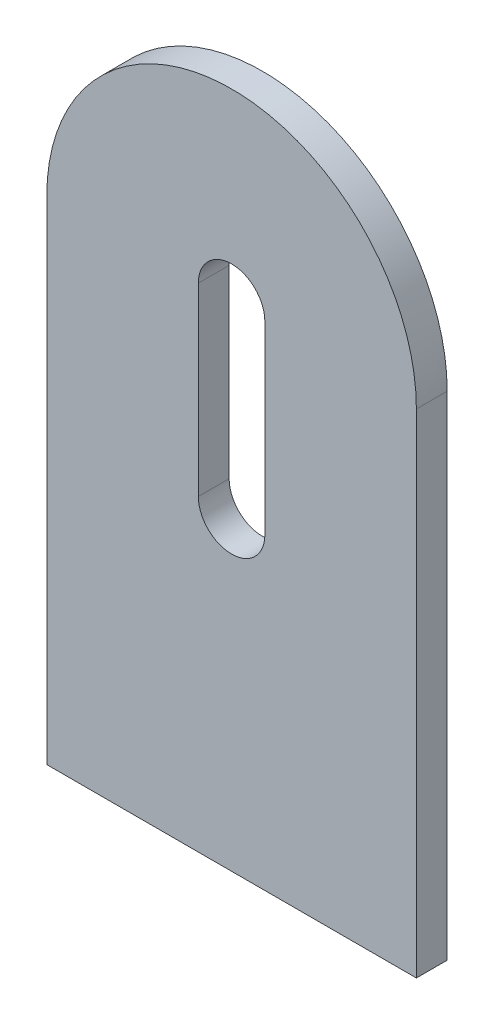
ISO-10303-21;
HEADER;
FILE_DESCRIPTION(('STEP AP214'),'2;1');
FILE_NAME('part.step','',(''),(''),'','','');
FILE_SCHEMA(('AUTOMOTIVE_DESIGN { 1 0 10303 214 1 1 1 1 }'));
ENDSEC;
DATA;
#1=APPLICATION_CONTEXT('core data for automotive mechanical design processes');
#2=APPLICATION_PROTOCOL_DEFINITION('international standard','automotive_design',2000,#1);
#3=PRODUCT_CONTEXT('',#1,'mechanical');
#4=PRODUCT('Part','Part','',(#3));
#5=PRODUCT_RELATED_PRODUCT_CATEGORY('part','',(#4));
#6=PRODUCT_DEFINITION_FORMATION('','',#4);
#7=PRODUCT_DEFINITION_CONTEXT('part definition',#1,'design');
#8=PRODUCT_DEFINITION('design','',#6,#7);
#9=PRODUCT_DEFINITION_SHAPE('','',#8);
#10=(LENGTH_UNIT() NAMED_UNIT(*) SI_UNIT(.MILLI.,.METRE.));
#11=(NAMED_UNIT(*) PLANE_ANGLE_UNIT() SI_UNIT($,.RADIAN.));
#12=(NAMED_UNIT(*) SI_UNIT($,.STERADIAN.) SOLID_ANGLE_UNIT());
#13=UNCERTAINTY_MEASURE_WITH_UNIT(LENGTH_MEASURE(1.E-05),#10,'distance_accuracy_value','');
#14=(GEOMETRIC_REPRESENTATION_CONTEXT(3) GLOBAL_UNCERTAINTY_ASSIGNED_CONTEXT((#13)) GLOBAL_UNIT_ASSIGNED_CONTEXT((#10,
#11,#12)) REPRESENTATION_CONTEXT('',''));
#15=CARTESIAN_POINT('',(0.,0.,0.));
#16=DIRECTION('',(0.,0.,1.));
#17=DIRECTION('',(1.,0.,0.));
#18=AXIS2_PLACEMENT_3D('',#15,#16,#17);
#19=CARTESIAN_POINT('',(19.05,50.8,3.175));
#20=DIRECTION('',(0.,0.,-1.));
#21=DIRECTION('',(-1.,0.,0.));
#22=AXIS2_PLACEMENT_3D('',#19,#20,#21);
#23=PLANE('',#22);
#24=DIRECTION('',(0.,-1.,0.));
#25=VECTOR('',#24,1.);
#26=CARTESIAN_POINT('',(0.,0.,3.175));
#27=LINE('',#26,#25);
#28=CARTESIAN_POINT('',(0.,50.8,3.175));
#29=VERTEX_POINT('',#28);
#30=CARTESIAN_POINT('',(0.,0.,3.175));
#31=VERTEX_POINT('',#30);
#32=EDGE_CURVE('E140',#29,#31,#27,.T.);
#33=ORIENTED_EDGE('',*,*,#32,.T.);
#34=DIRECTION('',(1.,0.,0.));
#35=VECTOR('',#34,1.);
#36=CARTESIAN_POINT('',(0.,0.,3.175));
#37=LINE('',#36,#35);
#38=CARTESIAN_POINT('',(38.1,0.,3.175));
#39=VERTEX_POINT('',#38);
#40=EDGE_CURVE('E143',#31,#39,#37,.T.);
#41=ORIENTED_EDGE('',*,*,#40,.T.);
#42=DIRECTION('',(0.,1.,0.));
#43=VECTOR('',#42,1.);
#44=CARTESIAN_POINT('',(38.1,0.,3.175));
#45=LINE('',#44,#43);
#46=CARTESIAN_POINT('',(38.1,50.8,3.175));
#47=VERTEX_POINT('',#46);
#48=EDGE_CURVE('E146',#39,#47,#45,.T.);
#49=ORIENTED_EDGE('',*,*,#48,.T.);
#50=CARTESIAN_POINT('',(19.05,50.8,3.175));
#51=DIRECTION('',(0.,0.,1.));
#52=DIRECTION('',(-1.,0.,0.));
#53=AXIS2_PLACEMENT_3D('',#50,#51,#52);
#54=CIRCLE('',#53,19.05);
#55=EDGE_CURVE('E148',#47,#29,#54,.T.);
#56=ORIENTED_EDGE('',*,*,#55,.T.);
#57=EDGE_LOOP('',(#33,#41,#49,#56));
#58=FACE_BOUND('',#57,.T.);
#59=CARTESIAN_POINT('',(19.05,50.8,3.175));
#60=DIRECTION('',(0.,0.,1.));
#61=DIRECTION('',(1.,0.,0.));
#62=AXIS2_PLACEMENT_3D('',#59,#60,#61);
#63=CIRCLE('',#62,3.429);
#64=CARTESIAN_POINT('',(22.479,50.8,3.175));
#65=VERTEX_POINT('',#64);
#66=CARTESIAN_POINT('',(15.621,50.8,3.175));
#67=VERTEX_POINT('',#66);
#68=EDGE_CURVE('E104',#65,#67,#63,.T.);
#69=ORIENTED_EDGE('',*,*,#68,.F.);
#70=DIRECTION('',(0.,1.,0.));
#71=VECTOR('',#70,1.);
#72=CARTESIAN_POINT('',(22.479,31.75,3.175));
#73=LINE('',#72,#71);
#74=CARTESIAN_POINT('',(22.479,31.75,3.175));
#75=VERTEX_POINT('',#74);
#76=EDGE_CURVE('E126',#75,#65,#73,.T.);
#77=ORIENTED_EDGE('',*,*,#76,.F.);
#78=CARTESIAN_POINT('',(19.05,31.75,3.175));
#79=DIRECTION('',(0.,0.,1.));
#80=DIRECTION('',(1.,0.,0.));
#81=AXIS2_PLACEMENT_3D('',#78,#79,#80);
#82=CIRCLE('',#81,3.429);
#83=CARTESIAN_POINT('',(15.621,31.75,3.175));
#84=VERTEX_POINT('',#83);
#85=EDGE_CURVE('E124',#84,#75,#82,.T.);
#86=ORIENTED_EDGE('',*,*,#85,.F.);
#87=DIRECTION('',(0.,-1.,0.));
#88=VECTOR('',#87,1.);
#89=CARTESIAN_POINT('',(15.621,50.8,3.175));
#90=LINE('',#89,#88);
#91=EDGE_CURVE('E112',#67,#84,#90,.T.);
#92=ORIENTED_EDGE('',*,*,#91,.F.);
#93=EDGE_LOOP('',(#69,#77,#86,#92));
#94=FACE_BOUND('',#93,.T.);
#95=ADVANCED_FACE('F39',(#58,#94),#23,.F.);
#96=CARTESIAN_POINT('',(19.05,50.8,0.));
#97=DIRECTION('',(0.,0.,-1.));
#98=DIRECTION('',(-1.,0.,0.));
#99=AXIS2_PLACEMENT_3D('',#96,#97,#98);
#100=PLANE('',#99);
#101=DIRECTION('',(0.,-1.,0.));
#102=VECTOR('',#101,1.);
#103=CARTESIAN_POINT('',(0.,0.,0.));
#104=LINE('',#103,#102);
#105=CARTESIAN_POINT('',(0.,50.8,0.));
#106=VERTEX_POINT('',#105);
#107=CARTESIAN_POINT('',(0.,0.,0.));
#108=VERTEX_POINT('',#107);
#109=EDGE_CURVE('E120',#106,#108,#104,.T.);
#110=ORIENTED_EDGE('',*,*,#109,.F.);
#111=CARTESIAN_POINT('',(19.05,50.8,0.));
#112=DIRECTION('',(0.,0.,1.));
#113=DIRECTION('',(-1.,0.,0.));
#114=AXIS2_PLACEMENT_3D('',#111,#112,#113);
#115=CIRCLE('',#114,19.05);
#116=CARTESIAN_POINT('',(38.1,50.8,0.));
#117=VERTEX_POINT('',#116);
#118=EDGE_CURVE('E144',#117,#106,#115,.T.);
#119=ORIENTED_EDGE('',*,*,#118,.F.);
#120=DIRECTION('',(0.,1.,0.));
#121=VECTOR('',#120,1.);
#122=CARTESIAN_POINT('',(38.1,0.,0.));
#123=LINE('',#122,#121);
#124=CARTESIAN_POINT('',(38.1,0.,0.));
#125=VERTEX_POINT('',#124);
#126=EDGE_CURVE('E155',#125,#117,#123,.T.);
#127=ORIENTED_EDGE('',*,*,#126,.F.);
#128=DIRECTION('',(1.,0.,0.));
#129=VECTOR('',#128,1.);
#130=CARTESIAN_POINT('',(0.,0.,0.));
#131=LINE('',#130,#129);
#132=EDGE_CURVE('E153',#108,#125,#131,.T.);
#133=ORIENTED_EDGE('',*,*,#132,.F.);
#134=EDGE_LOOP('',(#110,#119,#127,#133));
#135=FACE_BOUND('',#134,.T.);
#136=DIRECTION('',(0.,1.,0.));
#137=VECTOR('',#136,1.);
#138=CARTESIAN_POINT('',(22.479,31.75,0.));
#139=LINE('',#138,#137);
#140=CARTESIAN_POINT('',(22.479,31.75,0.));
#141=VERTEX_POINT('',#140);
#142=CARTESIAN_POINT('',(22.479,50.8,0.));
#143=VERTEX_POINT('',#142);
#144=EDGE_CURVE('E113',#141,#143,#139,.T.);
#145=ORIENTED_EDGE('',*,*,#144,.T.);
#146=CARTESIAN_POINT('',(19.05,50.8,0.));
#147=DIRECTION('',(0.,0.,1.));
#148=DIRECTION('',(1.,0.,0.));
#149=AXIS2_PLACEMENT_3D('',#146,#147,#148);
#150=CIRCLE('',#149,3.429);
#151=CARTESIAN_POINT('',(15.621,50.8,0.));
#152=VERTEX_POINT('',#151);
#153=EDGE_CURVE('E62',#143,#152,#150,.T.);
#154=ORIENTED_EDGE('',*,*,#153,.T.);
#155=DIRECTION('',(0.,-1.,0.));
#156=VECTOR('',#155,1.);
#157=CARTESIAN_POINT('',(15.621,50.8,0.));
#158=LINE('',#157,#156);
#159=CARTESIAN_POINT('',(15.621,31.75,0.));
#160=VERTEX_POINT('',#159);
#161=EDGE_CURVE('E119',#152,#160,#158,.T.);
#162=ORIENTED_EDGE('',*,*,#161,.T.);
#163=CARTESIAN_POINT('',(19.05,31.75,0.));
#164=DIRECTION('',(0.,0.,1.));
#165=DIRECTION('',(1.,0.,0.));
#166=AXIS2_PLACEMENT_3D('',#163,#164,#165);
#167=CIRCLE('',#166,3.429);
#168=EDGE_CURVE('E132',#160,#141,#167,.T.);
#169=ORIENTED_EDGE('',*,*,#168,.T.);
#170=EDGE_LOOP('',(#145,#154,#162,#169));
#171=FACE_BOUND('',#170,.T.);
#172=ADVANCED_FACE('F173',(#135,#171),#100,.T.);
#173=CARTESIAN_POINT('',(0.,0.,3.175));
#174=DIRECTION('',(1.,0.,0.));
#175=DIRECTION('',(0.,0.,-1.));
#176=AXIS2_PLACEMENT_3D('',#173,#174,#175);
#177=PLANE('',#176);
#178=ORIENTED_EDGE('',*,*,#109,.T.);
#179=DIRECTION('',(0.,0.,-1.));
#180=VECTOR('',#179,1.);
#181=CARTESIAN_POINT('',(0.,0.,3.175));
#182=LINE('',#181,#180);
#183=EDGE_CURVE('E11',#31,#108,#182,.T.);
#184=ORIENTED_EDGE('',*,*,#183,.F.);
#185=ORIENTED_EDGE('',*,*,#32,.F.);
#186=DIRECTION('',(0.,0.,-1.));
#187=VECTOR('',#186,1.);
#188=CARTESIAN_POINT('',(0.,50.8,3.175));
#189=LINE('',#188,#187);
#190=EDGE_CURVE('E150',#29,#106,#189,.T.);
#191=ORIENTED_EDGE('',*,*,#190,.T.);
#192=EDGE_LOOP('',(#178,#184,#185,#191));
#193=FACE_BOUND('',#192,.T.);
#194=ADVANCED_FACE('F41',(#193),#177,.F.);
#195=CARTESIAN_POINT('',(0.,0.,3.175));
#196=DIRECTION('',(0.,1.,0.));
#197=DIRECTION('',(0.,0.,1.));
#198=AXIS2_PLACEMENT_3D('',#195,#196,#197);
#199=PLANE('',#198);
#200=ORIENTED_EDGE('',*,*,#132,.T.);
#201=DIRECTION('',(0.,0.,-1.));
#202=VECTOR('',#201,1.);
#203=CARTESIAN_POINT('',(38.1,0.,3.175));
#204=LINE('',#203,#202);
#205=EDGE_CURVE('E47',#39,#125,#204,.T.);
#206=ORIENTED_EDGE('',*,*,#205,.F.);
#207=ORIENTED_EDGE('',*,*,#40,.F.);
#208=ORIENTED_EDGE('',*,*,#183,.T.);
#209=EDGE_LOOP('',(#200,#206,#207,#208));
#210=FACE_BOUND('',#209,.T.);
#211=ADVANCED_FACE('F183',(#210),#199,.F.);
#212=CARTESIAN_POINT('',(38.1,0.,3.175));
#213=DIRECTION('',(-1.,0.,0.));
#214=DIRECTION('',(0.,0.,1.));
#215=AXIS2_PLACEMENT_3D('',#212,#213,#214);
#216=PLANE('',#215);
#217=ORIENTED_EDGE('',*,*,#126,.T.);
#218=DIRECTION('',(0.,0.,-1.));
#219=VECTOR('',#218,1.);
#220=CARTESIAN_POINT('',(38.1,50.8,3.175));
#221=LINE('',#220,#219);
#222=EDGE_CURVE('E160',#47,#117,#221,.T.);
#223=ORIENTED_EDGE('',*,*,#222,.F.);
#224=ORIENTED_EDGE('',*,*,#48,.F.);
#225=ORIENTED_EDGE('',*,*,#205,.T.);
#226=EDGE_LOOP('',(#217,#223,#224,#225));
#227=FACE_BOUND('',#226,.T.);
#228=ADVANCED_FACE('F167',(#227),#216,.F.);
#229=CARTESIAN_POINT('',(19.05,50.8,3.175));
#230=DIRECTION('',(0.,0.,-1.));
#231=DIRECTION('',(-1.,0.,0.));
#232=AXIS2_PLACEMENT_3D('',#229,#230,#231);
#233=CYLINDRICAL_SURFACE('',#232,19.05);
#234=ORIENTED_EDGE('',*,*,#118,.T.);
#235=ORIENTED_EDGE('',*,*,#190,.F.);
#236=ORIENTED_EDGE('',*,*,#55,.F.);
#237=ORIENTED_EDGE('',*,*,#222,.T.);
#238=EDGE_LOOP('',(#234,#235,#236,#237));
#239=FACE_BOUND('',#238,.T.);
#240=ADVANCED_FACE('F177',(#239),#233,.T.);
#241=CARTESIAN_POINT('',(19.05,50.8,3.175));
#242=DIRECTION('',(0.,0.,-1.));
#243=DIRECTION('',(-1.,0.,0.));
#244=AXIS2_PLACEMENT_3D('',#241,#242,#243);
#245=CYLINDRICAL_SURFACE('',#244,3.429);
#246=ORIENTED_EDGE('',*,*,#153,.F.);
#247=DIRECTION('',(0.,0.,-1.));
#248=VECTOR('',#247,1.);
#249=CARTESIAN_POINT('',(22.479,50.8,3.175));
#250=LINE('',#249,#248);
#251=EDGE_CURVE('E108',#65,#143,#250,.T.);
#252=ORIENTED_EDGE('',*,*,#251,.F.);
#253=ORIENTED_EDGE('',*,*,#68,.T.);
#254=DIRECTION('',(0.,0.,-1.));
#255=VECTOR('',#254,1.);
#256=CARTESIAN_POINT('',(15.621,50.8,3.175));
#257=LINE('',#256,#255);
#258=EDGE_CURVE('E107',#67,#152,#257,.T.);
#259=ORIENTED_EDGE('',*,*,#258,.T.);
#260=EDGE_LOOP('',(#246,#252,#253,#259));
#261=FACE_BOUND('',#260,.T.);
#262=ADVANCED_FACE('F106',(#261),#245,.F.);
#263=CARTESIAN_POINT('',(15.621,50.8,3.175));
#264=DIRECTION('',(1.,0.,0.));
#265=DIRECTION('',(0.,1.,0.));
#266=AXIS2_PLACEMENT_3D('',#263,#264,#265);
#267=PLANE('',#266);
#268=ORIENTED_EDGE('',*,*,#161,.F.);
#269=ORIENTED_EDGE('',*,*,#258,.F.);
#270=ORIENTED_EDGE('',*,*,#91,.T.);
#271=DIRECTION('',(0.,0.,-1.));
#272=VECTOR('',#271,1.);
#273=CARTESIAN_POINT('',(15.621,31.75,3.175));
#274=LINE('',#273,#272);
#275=EDGE_CURVE('E121',#84,#160,#274,.T.);
#276=ORIENTED_EDGE('',*,*,#275,.T.);
#277=EDGE_LOOP('',(#268,#269,#270,#276));
#278=FACE_BOUND('',#277,.T.);
#279=ADVANCED_FACE('F116',(#278),#267,.T.);
#280=CARTESIAN_POINT('',(19.05,31.75,3.175));
#281=DIRECTION('',(0.,0.,-1.));
#282=DIRECTION('',(-1.,0.,0.));
#283=AXIS2_PLACEMENT_3D('',#280,#281,#282);
#284=CYLINDRICAL_SURFACE('',#283,3.429);
#285=ORIENTED_EDGE('',*,*,#168,.F.);
#286=ORIENTED_EDGE('',*,*,#275,.F.);
#287=ORIENTED_EDGE('',*,*,#85,.T.);
#288=DIRECTION('',(0.,0.,-1.));
#289=VECTOR('',#288,1.);
#290=CARTESIAN_POINT('',(22.479,31.75,3.175));
#291=LINE('',#290,#289);
#292=EDGE_CURVE('E54',#75,#141,#291,.T.);
#293=ORIENTED_EDGE('',*,*,#292,.T.);
#294=EDGE_LOOP('',(#285,#286,#287,#293));
#295=FACE_BOUND('',#294,.T.);
#296=ADVANCED_FACE('F206',(#295),#284,.F.);
#297=CARTESIAN_POINT('',(22.479,31.75,3.175));
#298=DIRECTION('',(-1.,0.,0.));
#299=DIRECTION('',(0.,-1.,0.));
#300=AXIS2_PLACEMENT_3D('',#297,#298,#299);
#301=PLANE('',#300);
#302=ORIENTED_EDGE('',*,*,#144,.F.);
#303=ORIENTED_EDGE('',*,*,#292,.F.);
#304=ORIENTED_EDGE('',*,*,#76,.T.);
#305=ORIENTED_EDGE('',*,*,#251,.T.);
#306=EDGE_LOOP('',(#302,#303,#304,#305));
#307=FACE_BOUND('',#306,.T.);
#308=ADVANCED_FACE('F210',(#307),#301,.T.);
#309=CLOSED_SHELL('',(#95,#172,#194,#211,#228,#240,#262,#279,#296,#308));
#310=MANIFOLD_SOLID_BREP('B2',#309);
#311=ADVANCED_BREP_SHAPE_REPRESENTATION('',(#18,#310),#14);
#312=SHAPE_DEFINITION_REPRESENTATION(#9,#311);
ENDSEC;
END-ISO-10303-21;
